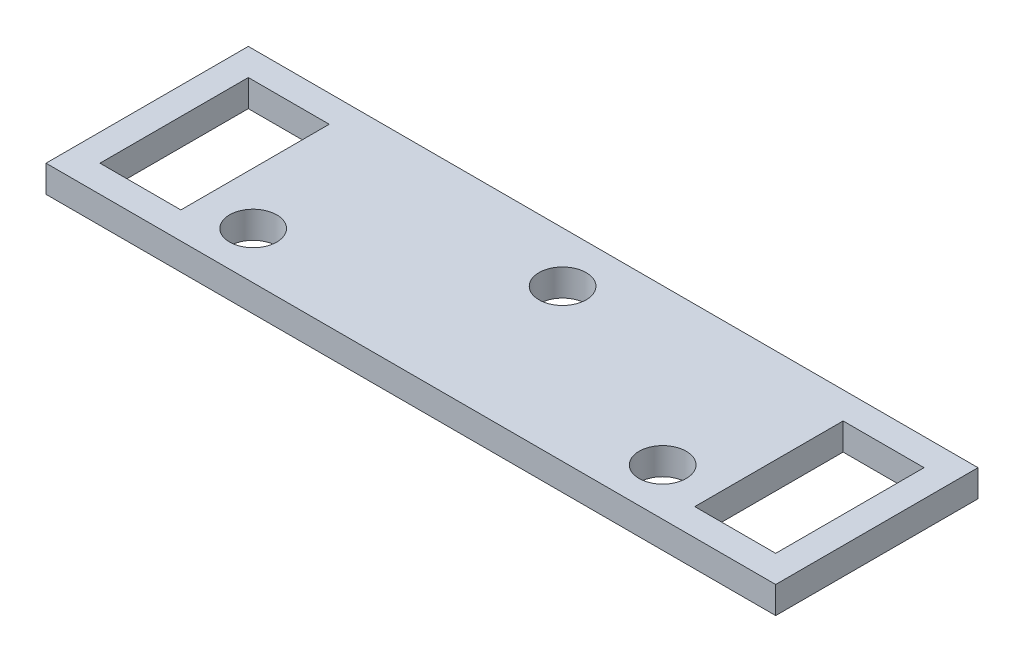
ISO-10303-21;
HEADER;
FILE_DESCRIPTION(('STEP AP214'),'2;1');
FILE_NAME('part.step','',(''),(''),'','','');
FILE_SCHEMA(('AUTOMOTIVE_DESIGN { 1 0 10303 214 1 1 1 1 }'));
ENDSEC;
DATA;
#1=APPLICATION_CONTEXT('core data for automotive mechanical design processes');
#2=APPLICATION_PROTOCOL_DEFINITION('international standard','automotive_design',2000,#1);
#3=PRODUCT_CONTEXT('',#1,'mechanical');
#4=PRODUCT('Part','Part','',(#3));
#5=PRODUCT_RELATED_PRODUCT_CATEGORY('part','',(#4));
#6=PRODUCT_DEFINITION_FORMATION('','',#4);
#7=PRODUCT_DEFINITION_CONTEXT('part definition',#1,'design');
#8=PRODUCT_DEFINITION('design','',#6,#7);
#9=PRODUCT_DEFINITION_SHAPE('','',#8);
#10=(LENGTH_UNIT() NAMED_UNIT(*) SI_UNIT(.MILLI.,.METRE.));
#11=(NAMED_UNIT(*) PLANE_ANGLE_UNIT() SI_UNIT($,.RADIAN.));
#12=(NAMED_UNIT(*) SI_UNIT($,.STERADIAN.) SOLID_ANGLE_UNIT());
#13=UNCERTAINTY_MEASURE_WITH_UNIT(LENGTH_MEASURE(1.E-05),#10,'distance_accuracy_value','');
#14=(GEOMETRIC_REPRESENTATION_CONTEXT(3) GLOBAL_UNCERTAINTY_ASSIGNED_CONTEXT((#13)) GLOBAL_UNIT_ASSIGNED_CONTEXT((#10,
#11,#12)) REPRESENTATION_CONTEXT('',''));
#15=CARTESIAN_POINT('',(0.,0.,0.));
#16=DIRECTION('',(0.,0.,1.));
#17=DIRECTION('',(1.,0.,0.));
#18=AXIS2_PLACEMENT_3D('',#15,#16,#17);
#19=CARTESIAN_POINT('',(0.,2.,0.));
#20=DIRECTION('',(0.,1.,0.));
#21=DIRECTION('',(0.,0.,1.));
#22=AXIS2_PLACEMENT_3D('',#19,#20,#21);
#23=PLANE('',#22);
#24=CARTESIAN_POINT('',(-13.6035764537518,2.,3.19059497319667));
#25=DIRECTION('',(0.,1.,0.));
#26=DIRECTION('',(0.,0.,1.));
#27=AXIS2_PLACEMENT_3D('',#24,#25,#26);
#28=CIRCLE('',#27,1.75);
#29=CARTESIAN_POINT('',(-13.6035764537518,2.,4.94059497319667));
#30=VERTEX_POINT('',#29);
#31=EDGE_CURVE('E195',#30,#30,#28,.T.);
#32=ORIENTED_EDGE('',*,*,#31,.F.);
#33=EDGE_LOOP('',(#32));
#34=FACE_BOUND('',#33,.T.);
#35=DIRECTION('',(0.,0.,1.));
#36=VECTOR('',#35,1.);
#37=CARTESIAN_POINT('',(-25.4735764537518,2.,-8.31940502680333));
#38=LINE('',#37,#36);
#39=CARTESIAN_POINT('',(-25.4735764537518,2.,-8.31940502680333));
#40=VERTEX_POINT('',#39);
#41=CARTESIAN_POINT('',(-25.4735764537518,2.,6.68059497319667));
#42=VERTEX_POINT('',#41);
#43=EDGE_CURVE('E207',#40,#42,#38,.T.);
#44=ORIENTED_EDGE('',*,*,#43,.T.);
#45=DIRECTION('',(1.,0.,0.));
#46=VECTOR('',#45,1.);
#47=CARTESIAN_POINT('',(-25.4735764537518,2.,6.68059497319667));
#48=LINE('',#47,#46);
#49=CARTESIAN_POINT('',(28.6264235462482,2.,6.68059497319667));
#50=VERTEX_POINT('',#49);
#51=EDGE_CURVE('E210',#42,#50,#48,.T.);
#52=ORIENTED_EDGE('',*,*,#51,.T.);
#53=DIRECTION('',(0.,0.,-1.));
#54=VECTOR('',#53,1.);
#55=CARTESIAN_POINT('',(28.6264235462482,2.,-8.31940502680333));
#56=LINE('',#55,#54);
#57=CARTESIAN_POINT('',(28.6264235462482,2.,-8.31940502680333));
#58=VERTEX_POINT('',#57);
#59=EDGE_CURVE('E213',#50,#58,#56,.T.);
#60=ORIENTED_EDGE('',*,*,#59,.T.);
#61=DIRECTION('',(-1.,0.,0.));
#62=VECTOR('',#61,1.);
#63=CARTESIAN_POINT('',(-25.4735764537518,2.,-8.31940502680333));
#64=LINE('',#63,#62);
#65=EDGE_CURVE('E215',#58,#40,#64,.T.);
#66=ORIENTED_EDGE('',*,*,#65,.T.);
#67=EDGE_LOOP('',(#44,#52,#60,#66));
#68=FACE_BOUND('',#67,.T.);
#69=CARTESIAN_POINT('',(16.7564235462482,2.,3.19059497319664));
#70=DIRECTION('',(0.,1.,0.));
#71=DIRECTION('',(0.,0.,1.));
#72=AXIS2_PLACEMENT_3D('',#69,#70,#71);
#73=CIRCLE('',#72,1.75);
#74=CARTESIAN_POINT('',(16.7564235462482,2.,4.94059497319664));
#75=VERTEX_POINT('',#74);
#76=EDGE_CURVE('E201',#75,#75,#73,.T.);
#77=ORIENTED_EDGE('',*,*,#76,.F.);
#78=EDGE_LOOP('',(#77));
#79=FACE_BOUND('',#78,.T.);
#80=CARTESIAN_POINT('',(1.57642354624821,2.,-4.56940502680333));
#81=DIRECTION('',(0.,1.,0.));
#82=DIRECTION('',(0.,0.,1.));
#83=AXIS2_PLACEMENT_3D('',#80,#81,#82);
#84=CIRCLE('',#83,1.75);
#85=CARTESIAN_POINT('',(1.57642354624821,2.,-2.81940502680333));
#86=VERTEX_POINT('',#85);
#87=EDGE_CURVE('E189',#86,#86,#84,.T.);
#88=ORIENTED_EDGE('',*,*,#87,.F.);
#89=EDGE_LOOP('',(#88));
#90=FACE_BOUND('',#89,.T.);
#91=DIRECTION('',(1.,0.,0.));
#92=VECTOR('',#91,1.);
#93=CARTESIAN_POINT('',(-23.4735764537518,2.,4.68059497319667));
#94=LINE('',#93,#92);
#95=CARTESIAN_POINT('',(-23.4735764537518,2.,4.68059497319667));
#96=VERTEX_POINT('',#95);
#97=CARTESIAN_POINT('',(-17.4735764537518,2.,4.68059497319667));
#98=VERTEX_POINT('',#97);
#99=EDGE_CURVE('E160',#96,#98,#94,.T.);
#100=ORIENTED_EDGE('',*,*,#99,.F.);
#101=DIRECTION('',(0.,0.,1.));
#102=VECTOR('',#101,1.);
#103=CARTESIAN_POINT('',(-23.4735764537518,2.,-6.31940502680333));
#104=LINE('',#103,#102);
#105=CARTESIAN_POINT('',(-23.4735764537518,2.,-6.31940502680333));
#106=VERTEX_POINT('',#105);
#107=EDGE_CURVE('E158',#106,#96,#104,.T.);
#108=ORIENTED_EDGE('',*,*,#107,.F.);
#109=DIRECTION('',(-1.,0.,0.));
#110=VECTOR('',#109,1.);
#111=CARTESIAN_POINT('',(-23.4735764537518,2.,-6.31940502680333));
#112=LINE('',#111,#110);
#113=CARTESIAN_POINT('',(-17.4735764537518,2.,-6.31940502680333));
#114=VERTEX_POINT('',#113);
#115=EDGE_CURVE('E166',#114,#106,#112,.T.);
#116=ORIENTED_EDGE('',*,*,#115,.F.);
#117=DIRECTION('',(0.,0.,-1.));
#118=VECTOR('',#117,1.);
#119=CARTESIAN_POINT('',(-17.4735764537518,2.,-6.31940502680333));
#120=LINE('',#119,#118);
#121=EDGE_CURVE('E163',#98,#114,#120,.T.);
#122=ORIENTED_EDGE('',*,*,#121,.F.);
#123=EDGE_LOOP('',(#100,#108,#116,#122));
#124=FACE_BOUND('',#123,.T.);
#125=DIRECTION('',(1.,0.,0.));
#126=VECTOR('',#125,1.);
#127=CARTESIAN_POINT('',(20.6264235462482,2.,4.68059497319667));
#128=LINE('',#127,#126);
#129=CARTESIAN_POINT('',(20.6264235462482,2.,4.68059497319667));
#130=VERTEX_POINT('',#129);
#131=CARTESIAN_POINT('',(26.6264235462482,2.,4.68059497319667));
#132=VERTEX_POINT('',#131);
#133=EDGE_CURVE('E130',#130,#132,#128,.T.);
#134=ORIENTED_EDGE('',*,*,#133,.F.);
#135=DIRECTION('',(0.,0.,1.));
#136=VECTOR('',#135,1.);
#137=CARTESIAN_POINT('',(20.6264235462482,2.,-6.31940502680333));
#138=LINE('',#137,#136);
#139=CARTESIAN_POINT('',(20.6264235462482,2.,-6.31940502680333));
#140=VERTEX_POINT('',#139);
#141=EDGE_CURVE('E122',#140,#130,#138,.T.);
#142=ORIENTED_EDGE('',*,*,#141,.F.);
#143=DIRECTION('',(-1.,0.,0.));
#144=VECTOR('',#143,1.);
#145=CARTESIAN_POINT('',(20.6264235462482,2.,-6.31940502680333));
#146=LINE('',#145,#144);
#147=CARTESIAN_POINT('',(26.6264235462482,2.,-6.31940502680333));
#148=VERTEX_POINT('',#147);
#149=EDGE_CURVE('E144',#148,#140,#146,.T.);
#150=ORIENTED_EDGE('',*,*,#149,.F.);
#151=DIRECTION('',(0.,0.,-1.));
#152=VECTOR('',#151,1.);
#153=CARTESIAN_POINT('',(26.6264235462482,2.,-6.31940502680333));
#154=LINE('',#153,#152);
#155=EDGE_CURVE('E142',#132,#148,#154,.T.);
#156=ORIENTED_EDGE('',*,*,#155,.F.);
#157=EDGE_LOOP('',(#134,#142,#150,#156));
#158=FACE_BOUND('',#157,.T.);
#159=ADVANCED_FACE('F33',(#34,#68,#79,#90,#124,#158),#23,.T.);
#160=CARTESIAN_POINT('',(0.,0.,0.));
#161=DIRECTION('',(0.,1.,0.));
#162=DIRECTION('',(0.,0.,1.));
#163=AXIS2_PLACEMENT_3D('',#160,#161,#162);
#164=PLANE('',#163);
#165=DIRECTION('',(0.,0.,1.));
#166=VECTOR('',#165,1.);
#167=CARTESIAN_POINT('',(-23.4735764537518,0.,-6.31940502680333));
#168=LINE('',#167,#166);
#169=CARTESIAN_POINT('',(-23.4735764537518,0.,-6.31940502680333));
#170=VERTEX_POINT('',#169);
#171=CARTESIAN_POINT('',(-23.4735764537518,0.,4.68059497319667));
#172=VERTEX_POINT('',#171);
#173=EDGE_CURVE('E138',#170,#172,#168,.T.);
#174=ORIENTED_EDGE('',*,*,#173,.T.);
#175=DIRECTION('',(1.,0.,0.));
#176=VECTOR('',#175,1.);
#177=CARTESIAN_POINT('',(-23.4735764537518,0.,4.68059497319667));
#178=LINE('',#177,#176);
#179=CARTESIAN_POINT('',(-17.4735764537518,0.,4.68059497319667));
#180=VERTEX_POINT('',#179);
#181=EDGE_CURVE('E171',#172,#180,#178,.T.);
#182=ORIENTED_EDGE('',*,*,#181,.T.);
#183=DIRECTION('',(0.,0.,-1.));
#184=VECTOR('',#183,1.);
#185=CARTESIAN_POINT('',(-17.4735764537518,0.,-6.31940502680333));
#186=LINE('',#185,#184);
#187=CARTESIAN_POINT('',(-17.4735764537518,0.,-6.31940502680333));
#188=VERTEX_POINT('',#187);
#189=EDGE_CURVE('E174',#180,#188,#186,.T.);
#190=ORIENTED_EDGE('',*,*,#189,.T.);
#191=DIRECTION('',(-1.,0.,0.));
#192=VECTOR('',#191,1.);
#193=CARTESIAN_POINT('',(-23.4735764537518,0.,-6.31940502680333));
#194=LINE('',#193,#192);
#195=EDGE_CURVE('E161',#188,#170,#194,.T.);
#196=ORIENTED_EDGE('',*,*,#195,.T.);
#197=EDGE_LOOP('',(#174,#182,#190,#196));
#198=FACE_BOUND('',#197,.T.);
#199=DIRECTION('',(0.,0.,1.));
#200=VECTOR('',#199,1.);
#201=CARTESIAN_POINT('',(-25.4735764537518,0.,-8.31940502680333));
#202=LINE('',#201,#200);
#203=CARTESIAN_POINT('',(-25.4735764537518,0.,-8.31940502680333));
#204=VERTEX_POINT('',#203);
#205=CARTESIAN_POINT('',(-25.4735764537518,0.,6.68059497319667));
#206=VERTEX_POINT('',#205);
#207=EDGE_CURVE('E204',#204,#206,#202,.T.);
#208=ORIENTED_EDGE('',*,*,#207,.F.);
#209=DIRECTION('',(-1.,0.,0.));
#210=VECTOR('',#209,1.);
#211=CARTESIAN_POINT('',(-25.4735764537518,0.,-8.31940502680333));
#212=LINE('',#211,#210);
#213=CARTESIAN_POINT('',(28.6264235462482,0.,-8.31940502680333));
#214=VERTEX_POINT('',#213);
#215=EDGE_CURVE('E211',#214,#204,#212,.T.);
#216=ORIENTED_EDGE('',*,*,#215,.F.);
#217=DIRECTION('',(0.,0.,-1.));
#218=VECTOR('',#217,1.);
#219=CARTESIAN_POINT('',(28.6264235462482,0.,-8.31940502680333));
#220=LINE('',#219,#218);
#221=CARTESIAN_POINT('',(28.6264235462482,0.,6.68059497319667));
#222=VERTEX_POINT('',#221);
#223=EDGE_CURVE('E222',#222,#214,#220,.T.);
#224=ORIENTED_EDGE('',*,*,#223,.F.);
#225=DIRECTION('',(1.,0.,0.));
#226=VECTOR('',#225,1.);
#227=CARTESIAN_POINT('',(-25.4735764537518,0.,6.68059497319667));
#228=LINE('',#227,#226);
#229=EDGE_CURVE('E220',#206,#222,#228,.T.);
#230=ORIENTED_EDGE('',*,*,#229,.F.);
#231=EDGE_LOOP('',(#208,#216,#224,#230));
#232=FACE_BOUND('',#231,.T.);
#233=CARTESIAN_POINT('',(16.7564235462482,0.,3.19059497319664));
#234=DIRECTION('',(0.,1.,0.));
#235=DIRECTION('',(0.,0.,1.));
#236=AXIS2_PLACEMENT_3D('',#233,#234,#235);
#237=CIRCLE('',#236,1.75);
#238=CARTESIAN_POINT('',(16.7564235462482,0.,4.94059497319664));
#239=VERTEX_POINT('',#238);
#240=EDGE_CURVE('E198',#239,#239,#237,.T.);
#241=ORIENTED_EDGE('',*,*,#240,.T.);
#242=EDGE_LOOP('',(#241));
#243=FACE_BOUND('',#242,.T.);
#244=CARTESIAN_POINT('',(-13.6035764537518,0.,3.19059497319667));
#245=DIRECTION('',(0.,1.,0.));
#246=DIRECTION('',(0.,0.,1.));
#247=AXIS2_PLACEMENT_3D('',#244,#245,#246);
#248=CIRCLE('',#247,1.75);
#249=CARTESIAN_POINT('',(-13.6035764537518,0.,4.94059497319667));
#250=VERTEX_POINT('',#249);
#251=EDGE_CURVE('E192',#250,#250,#248,.T.);
#252=ORIENTED_EDGE('',*,*,#251,.T.);
#253=EDGE_LOOP('',(#252));
#254=FACE_BOUND('',#253,.T.);
#255=CARTESIAN_POINT('',(1.57642354624821,0.,-4.56940502680333));
#256=DIRECTION('',(0.,1.,0.));
#257=DIRECTION('',(0.,0.,1.));
#258=AXIS2_PLACEMENT_3D('',#255,#256,#257);
#259=CIRCLE('',#258,1.75);
#260=CARTESIAN_POINT('',(1.57642354624821,0.,-2.81940502680333));
#261=VERTEX_POINT('',#260);
#262=EDGE_CURVE('E188',#261,#261,#259,.T.);
#263=ORIENTED_EDGE('',*,*,#262,.T.);
#264=EDGE_LOOP('',(#263));
#265=FACE_BOUND('',#264,.T.);
#266=DIRECTION('',(0.,0.,1.));
#267=VECTOR('',#266,1.);
#268=CARTESIAN_POINT('',(20.6264235462482,0.,-6.31940502680333));
#269=LINE('',#268,#267);
#270=CARTESIAN_POINT('',(20.6264235462482,0.,-6.31940502680333));
#271=VERTEX_POINT('',#270);
#272=CARTESIAN_POINT('',(20.6264235462482,0.,4.68059497319667));
#273=VERTEX_POINT('',#272);
#274=EDGE_CURVE('E56',#271,#273,#269,.T.);
#275=ORIENTED_EDGE('',*,*,#274,.T.);
#276=DIRECTION('',(1.,0.,0.));
#277=VECTOR('',#276,1.);
#278=CARTESIAN_POINT('',(20.6264235462482,0.,4.68059497319667));
#279=LINE('',#278,#277);
#280=CARTESIAN_POINT('',(26.6264235462482,0.,4.68059497319667));
#281=VERTEX_POINT('',#280);
#282=EDGE_CURVE('E137',#273,#281,#279,.T.);
#283=ORIENTED_EDGE('',*,*,#282,.T.);
#284=DIRECTION('',(0.,0.,-1.));
#285=VECTOR('',#284,1.);
#286=CARTESIAN_POINT('',(26.6264235462482,0.,-6.31940502680333));
#287=LINE('',#286,#285);
#288=CARTESIAN_POINT('',(26.6264235462482,0.,-6.31940502680333));
#289=VERTEX_POINT('',#288);
#290=EDGE_CURVE('E150',#281,#289,#287,.T.);
#291=ORIENTED_EDGE('',*,*,#290,.T.);
#292=DIRECTION('',(-1.,0.,0.));
#293=VECTOR('',#292,1.);
#294=CARTESIAN_POINT('',(20.6264235462482,0.,-6.31940502680333));
#295=LINE('',#294,#293);
#296=EDGE_CURVE('E131',#289,#271,#295,.T.);
#297=ORIENTED_EDGE('',*,*,#296,.T.);
#298=EDGE_LOOP('',(#275,#283,#291,#297));
#299=FACE_BOUND('',#298,.T.);
#300=ADVANCED_FACE('F240',(#198,#232,#243,#254,#265,#299),#164,.F.);
#301=CARTESIAN_POINT('',(-25.4735764537518,2.,-8.31940502680333));
#302=DIRECTION('',(1.,0.,0.));
#303=DIRECTION('',(0.,0.,-1.));
#304=AXIS2_PLACEMENT_3D('',#301,#302,#303);
#305=PLANE('',#304);
#306=ORIENTED_EDGE('',*,*,#207,.T.);
#307=DIRECTION('',(0.,-1.,0.));
#308=VECTOR('',#307,1.);
#309=CARTESIAN_POINT('',(-25.4735764537518,2.,6.68059497319667));
#310=LINE('',#309,#308);
#311=EDGE_CURVE('E11',#42,#206,#310,.T.);
#312=ORIENTED_EDGE('',*,*,#311,.F.);
#313=ORIENTED_EDGE('',*,*,#43,.F.);
#314=DIRECTION('',(0.,-1.,0.));
#315=VECTOR('',#314,1.);
#316=CARTESIAN_POINT('',(-25.4735764537518,2.,-8.31940502680333));
#317=LINE('',#316,#315);
#318=EDGE_CURVE('E217',#40,#204,#317,.T.);
#319=ORIENTED_EDGE('',*,*,#318,.T.);
#320=EDGE_LOOP('',(#306,#312,#313,#319));
#321=FACE_BOUND('',#320,.T.);
#322=ADVANCED_FACE('F35',(#321),#305,.F.);
#323=CARTESIAN_POINT('',(-25.4735764537518,2.,6.68059497319667));
#324=DIRECTION('',(0.,0.,-1.));
#325=DIRECTION('',(-1.,0.,0.));
#326=AXIS2_PLACEMENT_3D('',#323,#324,#325);
#327=PLANE('',#326);
#328=ORIENTED_EDGE('',*,*,#229,.T.);
#329=DIRECTION('',(0.,-1.,0.));
#330=VECTOR('',#329,1.);
#331=CARTESIAN_POINT('',(28.6264235462482,2.,6.68059497319667));
#332=LINE('',#331,#330);
#333=EDGE_CURVE('E41',#50,#222,#332,.T.);
#334=ORIENTED_EDGE('',*,*,#333,.F.);
#335=ORIENTED_EDGE('',*,*,#51,.F.);
#336=ORIENTED_EDGE('',*,*,#311,.T.);
#337=EDGE_LOOP('',(#328,#334,#335,#336));
#338=FACE_BOUND('',#337,.T.);
#339=ADVANCED_FACE('F251',(#338),#327,.F.);
#340=CARTESIAN_POINT('',(28.6264235462482,2.,-8.31940502680333));
#341=DIRECTION('',(-1.,0.,0.));
#342=DIRECTION('',(0.,0.,1.));
#343=AXIS2_PLACEMENT_3D('',#340,#341,#342);
#344=PLANE('',#343);
#345=ORIENTED_EDGE('',*,*,#223,.T.);
#346=DIRECTION('',(0.,-1.,0.));
#347=VECTOR('',#346,1.);
#348=CARTESIAN_POINT('',(28.6264235462482,2.,-8.31940502680333));
#349=LINE('',#348,#347);
#350=EDGE_CURVE('E227',#58,#214,#349,.T.);
#351=ORIENTED_EDGE('',*,*,#350,.F.);
#352=ORIENTED_EDGE('',*,*,#59,.F.);
#353=ORIENTED_EDGE('',*,*,#333,.T.);
#354=EDGE_LOOP('',(#345,#351,#352,#353));
#355=FACE_BOUND('',#354,.T.);
#356=ADVANCED_FACE('F234',(#355),#344,.F.);
#357=CARTESIAN_POINT('',(-25.4735764537518,2.,-8.31940502680333));
#358=DIRECTION('',(0.,0.,1.));
#359=DIRECTION('',(1.,0.,0.));
#360=AXIS2_PLACEMENT_3D('',#357,#358,#359);
#361=PLANE('',#360);
#362=ORIENTED_EDGE('',*,*,#215,.T.);
#363=ORIENTED_EDGE('',*,*,#318,.F.);
#364=ORIENTED_EDGE('',*,*,#65,.F.);
#365=ORIENTED_EDGE('',*,*,#350,.T.);
#366=EDGE_LOOP('',(#362,#363,#364,#365));
#367=FACE_BOUND('',#366,.T.);
#368=ADVANCED_FACE('F244',(#367),#361,.F.);
#369=CARTESIAN_POINT('',(16.7564235462482,2.,3.19059497319664));
#370=DIRECTION('',(0.,-1.,0.));
#371=DIRECTION('',(0.,0.,-1.));
#372=AXIS2_PLACEMENT_3D('',#369,#370,#371);
#373=CYLINDRICAL_SURFACE('',#372,1.75);
#374=ORIENTED_EDGE('',*,*,#76,.T.);
#375=EDGE_LOOP('',(#374));
#376=FACE_BOUND('',#375,.T.);
#377=ORIENTED_EDGE('',*,*,#240,.F.);
#378=EDGE_LOOP('',(#377));
#379=FACE_BOUND('',#378,.T.);
#380=ADVANCED_FACE('F268',(#376,#379),#373,.F.);
#381=CARTESIAN_POINT('',(-13.6035764537518,2.,3.19059497319667));
#382=DIRECTION('',(0.,-1.,0.));
#383=DIRECTION('',(0.,0.,-1.));
#384=AXIS2_PLACEMENT_3D('',#381,#382,#383);
#385=CYLINDRICAL_SURFACE('',#384,1.75);
#386=ORIENTED_EDGE('',*,*,#31,.T.);
#387=EDGE_LOOP('',(#386));
#388=FACE_BOUND('',#387,.T.);
#389=ORIENTED_EDGE('',*,*,#251,.F.);
#390=EDGE_LOOP('',(#389));
#391=FACE_BOUND('',#390,.T.);
#392=ADVANCED_FACE('F275',(#388,#391),#385,.F.);
#393=CARTESIAN_POINT('',(1.57642354624821,2.,-4.56940502680333));
#394=DIRECTION('',(0.,-1.,0.));
#395=DIRECTION('',(0.,0.,-1.));
#396=AXIS2_PLACEMENT_3D('',#393,#394,#395);
#397=CYLINDRICAL_SURFACE('',#396,1.75);
#398=ORIENTED_EDGE('',*,*,#87,.T.);
#399=EDGE_LOOP('',(#398));
#400=FACE_BOUND('',#399,.T.);
#401=ORIENTED_EDGE('',*,*,#262,.F.);
#402=EDGE_LOOP('',(#401));
#403=FACE_BOUND('',#402,.T.);
#404=ADVANCED_FACE('F280',(#400,#403),#397,.F.);
#405=CARTESIAN_POINT('',(-23.4735764537518,2.,-6.31940502680333));
#406=DIRECTION('',(1.,0.,0.));
#407=DIRECTION('',(0.,0.,-1.));
#408=AXIS2_PLACEMENT_3D('',#405,#406,#407);
#409=PLANE('',#408);
#410=ORIENTED_EDGE('',*,*,#173,.F.);
#411=DIRECTION('',(0.,-1.,0.));
#412=VECTOR('',#411,1.);
#413=CARTESIAN_POINT('',(-23.4735764537518,2.,-6.31940502680333));
#414=LINE('',#413,#412);
#415=EDGE_CURVE('E168',#106,#170,#414,.T.);
#416=ORIENTED_EDGE('',*,*,#415,.F.);
#417=ORIENTED_EDGE('',*,*,#107,.T.);
#418=DIRECTION('',(0.,-1.,0.));
#419=VECTOR('',#418,1.);
#420=CARTESIAN_POINT('',(-23.4735764537518,2.,4.68059497319667));
#421=LINE('',#420,#419);
#422=EDGE_CURVE('E185',#96,#172,#421,.T.);
#423=ORIENTED_EDGE('',*,*,#422,.T.);
#424=EDGE_LOOP('',(#410,#416,#417,#423));
#425=FACE_BOUND('',#424,.T.);
#426=ADVANCED_FACE('F316',(#425),#409,.T.);
#427=CARTESIAN_POINT('',(-23.4735764537518,2.,4.68059497319667));
#428=DIRECTION('',(0.,0.,-1.));
#429=DIRECTION('',(-1.,0.,0.));
#430=AXIS2_PLACEMENT_3D('',#427,#428,#429);
#431=PLANE('',#430);
#432=ORIENTED_EDGE('',*,*,#181,.F.);
#433=ORIENTED_EDGE('',*,*,#422,.F.);
#434=ORIENTED_EDGE('',*,*,#99,.T.);
#435=DIRECTION('',(0.,-1.,0.));
#436=VECTOR('',#435,1.);
#437=CARTESIAN_POINT('',(-17.4735764537518,2.,4.68059497319667));
#438=LINE('',#437,#436);
#439=EDGE_CURVE('E183',#98,#180,#438,.T.);
#440=ORIENTED_EDGE('',*,*,#439,.T.);
#441=EDGE_LOOP('',(#432,#433,#434,#440));
#442=FACE_BOUND('',#441,.T.);
#443=ADVANCED_FACE('F312',(#442),#431,.T.);
#444=CARTESIAN_POINT('',(-17.4735764537518,2.,-6.31940502680333));
#445=DIRECTION('',(-1.,0.,0.));
#446=DIRECTION('',(0.,0.,1.));
#447=AXIS2_PLACEMENT_3D('',#444,#445,#446);
#448=PLANE('',#447);
#449=ORIENTED_EDGE('',*,*,#189,.F.);
#450=ORIENTED_EDGE('',*,*,#439,.F.);
#451=ORIENTED_EDGE('',*,*,#121,.T.);
#452=DIRECTION('',(0.,-1.,0.));
#453=VECTOR('',#452,1.);
#454=CARTESIAN_POINT('',(-17.4735764537518,2.,-6.31940502680333));
#455=LINE('',#454,#453);
#456=EDGE_CURVE('E181',#114,#188,#455,.T.);
#457=ORIENTED_EDGE('',*,*,#456,.T.);
#458=EDGE_LOOP('',(#449,#450,#451,#457));
#459=FACE_BOUND('',#458,.T.);
#460=ADVANCED_FACE('F308',(#459),#448,.T.);
#461=CARTESIAN_POINT('',(-23.4735764537518,2.,-6.31940502680333));
#462=DIRECTION('',(0.,0.,1.));
#463=DIRECTION('',(1.,0.,0.));
#464=AXIS2_PLACEMENT_3D('',#461,#462,#463);
#465=PLANE('',#464);
#466=ORIENTED_EDGE('',*,*,#195,.F.);
#467=ORIENTED_EDGE('',*,*,#456,.F.);
#468=ORIENTED_EDGE('',*,*,#115,.T.);
#469=ORIENTED_EDGE('',*,*,#415,.T.);
#470=EDGE_LOOP('',(#466,#467,#468,#469));
#471=FACE_BOUND('',#470,.T.);
#472=ADVANCED_FACE('F305',(#471),#465,.T.);
#473=CARTESIAN_POINT('',(20.6264235462482,2.,-6.31940502680333));
#474=DIRECTION('',(1.,0.,0.));
#475=DIRECTION('',(0.,0.,-1.));
#476=AXIS2_PLACEMENT_3D('',#473,#474,#475);
#477=PLANE('',#476);
#478=ORIENTED_EDGE('',*,*,#274,.F.);
#479=DIRECTION('',(0.,-1.,0.));
#480=VECTOR('',#479,1.);
#481=CARTESIAN_POINT('',(20.6264235462482,2.,-6.31940502680333));
#482=LINE('',#481,#480);
#483=EDGE_CURVE('E126',#140,#271,#482,.T.);
#484=ORIENTED_EDGE('',*,*,#483,.F.);
#485=ORIENTED_EDGE('',*,*,#141,.T.);
#486=DIRECTION('',(0.,-1.,0.));
#487=VECTOR('',#486,1.);
#488=CARTESIAN_POINT('',(20.6264235462482,2.,4.68059497319667));
#489=LINE('',#488,#487);
#490=EDGE_CURVE('E125',#130,#273,#489,.T.);
#491=ORIENTED_EDGE('',*,*,#490,.T.);
#492=EDGE_LOOP('',(#478,#484,#485,#491));
#493=FACE_BOUND('',#492,.T.);
#494=ADVANCED_FACE('F124',(#493),#477,.T.);
#495=CARTESIAN_POINT('',(20.6264235462482,2.,4.68059497319667));
#496=DIRECTION('',(0.,0.,-1.));
#497=DIRECTION('',(-1.,0.,0.));
#498=AXIS2_PLACEMENT_3D('',#495,#496,#497);
#499=PLANE('',#498);
#500=ORIENTED_EDGE('',*,*,#282,.F.);
#501=ORIENTED_EDGE('',*,*,#490,.F.);
#502=ORIENTED_EDGE('',*,*,#133,.T.);
#503=DIRECTION('',(0.,-1.,0.));
#504=VECTOR('',#503,1.);
#505=CARTESIAN_POINT('',(26.6264235462482,2.,4.68059497319667));
#506=LINE('',#505,#504);
#507=EDGE_CURVE('E139',#132,#281,#506,.T.);
#508=ORIENTED_EDGE('',*,*,#507,.T.);
#509=EDGE_LOOP('',(#500,#501,#502,#508));
#510=FACE_BOUND('',#509,.T.);
#511=ADVANCED_FACE('F134',(#510),#499,.T.);
#512=CARTESIAN_POINT('',(26.6264235462482,2.,-6.31940502680333));
#513=DIRECTION('',(-1.,0.,0.));
#514=DIRECTION('',(0.,0.,1.));
#515=AXIS2_PLACEMENT_3D('',#512,#513,#514);
#516=PLANE('',#515);
#517=ORIENTED_EDGE('',*,*,#290,.F.);
#518=ORIENTED_EDGE('',*,*,#507,.F.);
#519=ORIENTED_EDGE('',*,*,#155,.T.);
#520=DIRECTION('',(0.,-1.,0.));
#521=VECTOR('',#520,1.);
#522=CARTESIAN_POINT('',(26.6264235462482,2.,-6.31940502680333));
#523=LINE('',#522,#521);
#524=EDGE_CURVE('E48',#148,#289,#523,.T.);
#525=ORIENTED_EDGE('',*,*,#524,.T.);
#526=EDGE_LOOP('',(#517,#518,#519,#525));
#527=FACE_BOUND('',#526,.T.);
#528=ADVANCED_FACE('F293',(#527),#516,.T.);
#529=CARTESIAN_POINT('',(20.6264235462482,2.,-6.31940502680333));
#530=DIRECTION('',(0.,0.,1.));
#531=DIRECTION('',(1.,0.,0.));
#532=AXIS2_PLACEMENT_3D('',#529,#530,#531);
#533=PLANE('',#532);
#534=ORIENTED_EDGE('',*,*,#296,.F.);
#535=ORIENTED_EDGE('',*,*,#524,.F.);
#536=ORIENTED_EDGE('',*,*,#149,.T.);
#537=ORIENTED_EDGE('',*,*,#483,.T.);
#538=EDGE_LOOP('',(#534,#535,#536,#537));
#539=FACE_BOUND('',#538,.T.);
#540=ADVANCED_FACE('F291',(#539),#533,.T.);
#541=CLOSED_SHELL('',(#159,#300,#322,#339,#356,#368,#380,#392,#404,#426,#443,#460,#472,#494,
#511,#528,#540));
#542=MANIFOLD_SOLID_BREP('B2',#541);
#543=ADVANCED_BREP_SHAPE_REPRESENTATION('',(#18,#542),#14);
#544=SHAPE_DEFINITION_REPRESENTATION(#9,#543);
ENDSEC;
END-ISO-10303-21;
